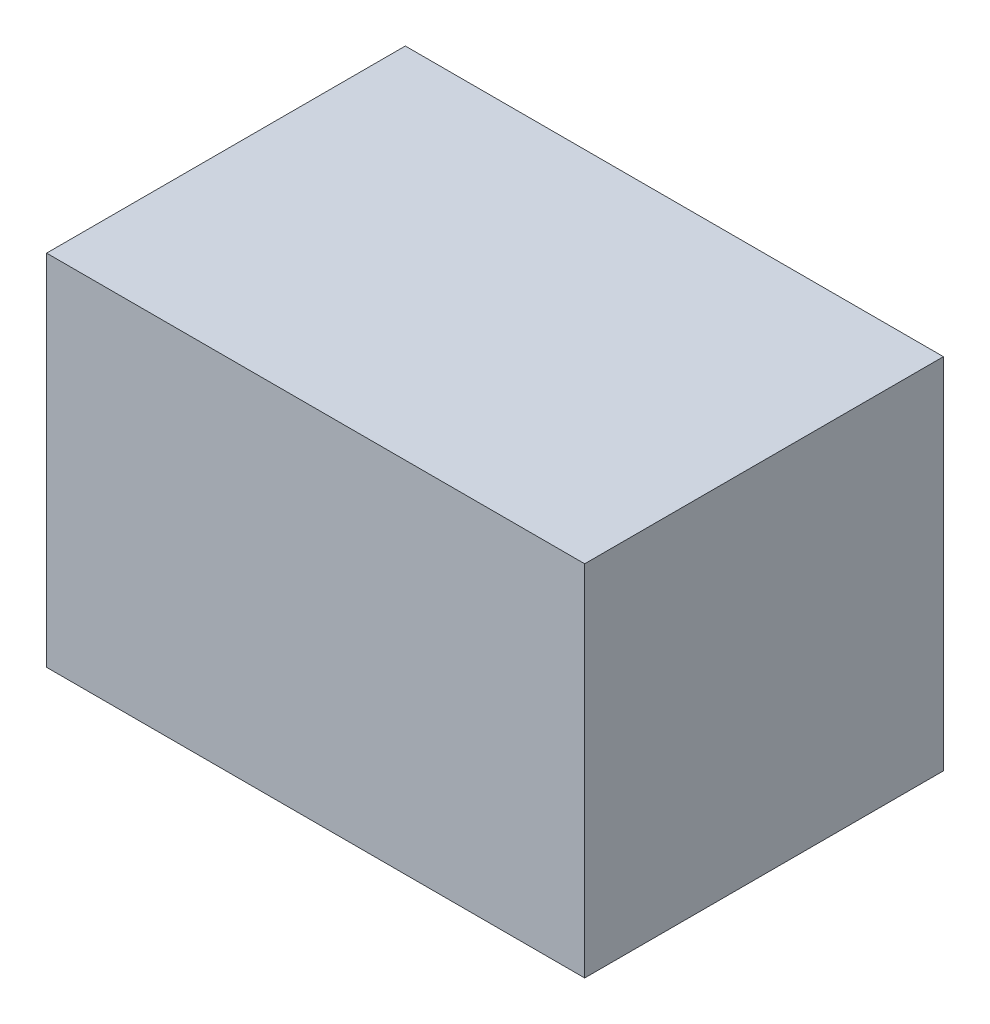
ISO-10303-21;
HEADER;
FILE_DESCRIPTION(('STEP AP214'),'2;1');
FILE_NAME('part.step','',(''),(''),'','','');
FILE_SCHEMA(('AUTOMOTIVE_DESIGN { 1 0 10303 214 1 1 1 1 }'));
ENDSEC;
DATA;
#1=APPLICATION_CONTEXT('core data for automotive mechanical design processes');
#2=APPLICATION_PROTOCOL_DEFINITION('international standard','automotive_design',2000,#1);
#3=PRODUCT_CONTEXT('',#1,'mechanical');
#4=PRODUCT('Part','Part','',(#3));
#5=PRODUCT_RELATED_PRODUCT_CATEGORY('part','',(#4));
#6=PRODUCT_DEFINITION_FORMATION('','',#4);
#7=PRODUCT_DEFINITION_CONTEXT('part definition',#1,'design');
#8=PRODUCT_DEFINITION('design','',#6,#7);
#9=PRODUCT_DEFINITION_SHAPE('','',#8);
#10=(LENGTH_UNIT() NAMED_UNIT(*) SI_UNIT(.MILLI.,.METRE.));
#11=(NAMED_UNIT(*) PLANE_ANGLE_UNIT() SI_UNIT($,.RADIAN.));
#12=(NAMED_UNIT(*) SI_UNIT($,.STERADIAN.) SOLID_ANGLE_UNIT());
#13=UNCERTAINTY_MEASURE_WITH_UNIT(LENGTH_MEASURE(1.E-05),#10,'distance_accuracy_value','');
#14=(GEOMETRIC_REPRESENTATION_CONTEXT(3) GLOBAL_UNCERTAINTY_ASSIGNED_CONTEXT((#13)) GLOBAL_UNIT_ASSIGNED_CONTEXT((#10,
#11,#12)) REPRESENTATION_CONTEXT('',''));
#15=CARTESIAN_POINT('',(0.,0.,0.));
#16=DIRECTION('',(0.,0.,1.));
#17=DIRECTION('',(1.,0.,0.));
#18=AXIS2_PLACEMENT_3D('',#15,#16,#17);
#19=CARTESIAN_POINT('',(550.,900.,-640.));
#20=DIRECTION('',(-1.,0.,0.));
#21=DIRECTION('',(0.,0.,1.));
#22=AXIS2_PLACEMENT_3D('',#19,#20,#21);
#23=PLANE('',#22);
#24=DIRECTION('',(0.,-1.,0.));
#25=VECTOR('',#24,1.);
#26=CARTESIAN_POINT('',(550.,900.,-620.));
#27=LINE('',#26,#25);
#28=CARTESIAN_POINT('',(550.,920.,-620.));
#29=VERTEX_POINT('',#28);
#30=CARTESIAN_POINT('',(550.,900.,-620.));
#31=VERTEX_POINT('',#30);
#32=EDGE_CURVE('E103',#29,#31,#27,.T.);
#33=ORIENTED_EDGE('',*,*,#32,.F.);
#34=DIRECTION('',(0.,0.,1.));
#35=VECTOR('',#34,1.);
#36=CARTESIAN_POINT('',(550.,920.,-640.));
#37=LINE('',#36,#35);
#38=CARTESIAN_POINT('',(550.,920.,-640.));
#39=VERTEX_POINT('',#38);
#40=EDGE_CURVE('E11',#39,#29,#37,.T.);
#41=ORIENTED_EDGE('',*,*,#40,.F.);
#42=DIRECTION('',(0.,-1.,0.));
#43=VECTOR('',#42,1.);
#44=CARTESIAN_POINT('',(550.,900.,-640.));
#45=LINE('',#44,#43);
#46=CARTESIAN_POINT('',(550.,900.,-640.));
#47=VERTEX_POINT('',#46);
#48=EDGE_CURVE('E97',#39,#47,#45,.T.);
#49=ORIENTED_EDGE('',*,*,#48,.T.);
#50=DIRECTION('',(0.,0.,1.));
#51=VECTOR('',#50,1.);
#52=CARTESIAN_POINT('',(550.,900.,-640.));
#53=LINE('',#52,#51);
#54=EDGE_CURVE('E42',#47,#31,#53,.T.);
#55=ORIENTED_EDGE('',*,*,#54,.T.);
#56=EDGE_LOOP('',(#33,#41,#49,#55));
#57=FACE_BOUND('',#56,.T.);
#58=ADVANCED_FACE('F39',(#57),#23,.T.);
#59=CARTESIAN_POINT('',(550.,920.,-640.));
#60=DIRECTION('',(0.,1.,0.));
#61=DIRECTION('',(0.,0.,1.));
#62=AXIS2_PLACEMENT_3D('',#59,#60,#61);
#63=PLANE('',#62);
#64=DIRECTION('',(-1.,0.,0.));
#65=VECTOR('',#64,1.);
#66=CARTESIAN_POINT('',(550.,920.,-620.));
#67=LINE('',#66,#65);
#68=CARTESIAN_POINT('',(580.,920.,-620.));
#69=VERTEX_POINT('',#68);
#70=EDGE_CURVE('E99',#69,#29,#67,.T.);
#71=ORIENTED_EDGE('',*,*,#70,.F.);
#72=DIRECTION('',(0.,0.,1.));
#73=VECTOR('',#72,1.);
#74=CARTESIAN_POINT('',(580.,920.,-640.));
#75=LINE('',#74,#73);
#76=CARTESIAN_POINT('',(580.,920.,-640.));
#77=VERTEX_POINT('',#76);
#78=EDGE_CURVE('E48',#77,#69,#75,.T.);
#79=ORIENTED_EDGE('',*,*,#78,.F.);
#80=DIRECTION('',(-1.,0.,0.));
#81=VECTOR('',#80,1.);
#82=CARTESIAN_POINT('',(550.,920.,-640.));
#83=LINE('',#82,#81);
#84=EDGE_CURVE('E94',#77,#39,#83,.T.);
#85=ORIENTED_EDGE('',*,*,#84,.T.);
#86=ORIENTED_EDGE('',*,*,#40,.T.);
#87=EDGE_LOOP('',(#71,#79,#85,#86));
#88=FACE_BOUND('',#87,.T.);
#89=ADVANCED_FACE('F113',(#88),#63,.T.);
#90=CARTESIAN_POINT('',(580.,900.,-640.));
#91=DIRECTION('',(1.,0.,0.));
#92=DIRECTION('',(0.,0.,-1.));
#93=AXIS2_PLACEMENT_3D('',#90,#91,#92);
#94=PLANE('',#93);
#95=DIRECTION('',(0.,1.,0.));
#96=VECTOR('',#95,1.);
#97=CARTESIAN_POINT('',(580.,900.,-620.));
#98=LINE('',#97,#96);
#99=CARTESIAN_POINT('',(580.,900.,-620.));
#100=VERTEX_POINT('',#99);
#101=EDGE_CURVE('E89',#100,#69,#98,.T.);
#102=ORIENTED_EDGE('',*,*,#101,.F.);
#103=DIRECTION('',(0.,0.,1.));
#104=VECTOR('',#103,1.);
#105=CARTESIAN_POINT('',(580.,900.,-640.));
#106=LINE('',#105,#104);
#107=CARTESIAN_POINT('',(580.,900.,-640.));
#108=VERTEX_POINT('',#107);
#109=EDGE_CURVE('E84',#108,#100,#106,.T.);
#110=ORIENTED_EDGE('',*,*,#109,.F.);
#111=DIRECTION('',(0.,1.,0.));
#112=VECTOR('',#111,1.);
#113=CARTESIAN_POINT('',(580.,900.,-640.));
#114=LINE('',#113,#112);
#115=EDGE_CURVE('E87',#108,#77,#114,.T.);
#116=ORIENTED_EDGE('',*,*,#115,.T.);
#117=ORIENTED_EDGE('',*,*,#78,.T.);
#118=EDGE_LOOP('',(#102,#110,#116,#117));
#119=FACE_BOUND('',#118,.T.);
#120=ADVANCED_FACE('F86',(#119),#94,.T.);
#121=CARTESIAN_POINT('',(550.,900.,-640.));
#122=DIRECTION('',(0.,-1.,0.));
#123=DIRECTION('',(0.,0.,-1.));
#124=AXIS2_PLACEMENT_3D('',#121,#122,#123);
#125=PLANE('',#124);
#126=DIRECTION('',(1.,0.,0.));
#127=VECTOR('',#126,1.);
#128=CARTESIAN_POINT('',(550.,900.,-620.));
#129=LINE('',#128,#127);
#130=EDGE_CURVE('E106',#31,#100,#129,.T.);
#131=ORIENTED_EDGE('',*,*,#130,.F.);
#132=ORIENTED_EDGE('',*,*,#54,.F.);
#133=DIRECTION('',(1.,0.,0.));
#134=VECTOR('',#133,1.);
#135=CARTESIAN_POINT('',(550.,900.,-640.));
#136=LINE('',#135,#134);
#137=EDGE_CURVE('E93',#47,#108,#136,.T.);
#138=ORIENTED_EDGE('',*,*,#137,.T.);
#139=ORIENTED_EDGE('',*,*,#109,.T.);
#140=EDGE_LOOP('',(#131,#132,#138,#139));
#141=FACE_BOUND('',#140,.T.);
#142=ADVANCED_FACE('F96',(#141),#125,.T.);
#143=CARTESIAN_POINT('',(0.,0.,-640.));
#144=DIRECTION('',(0.,0.,-1.));
#145=DIRECTION('',(-1.,0.,0.));
#146=AXIS2_PLACEMENT_3D('',#143,#144,#145);
#147=PLANE('',#146);
#148=ORIENTED_EDGE('',*,*,#48,.F.);
#149=ORIENTED_EDGE('',*,*,#84,.F.);
#150=ORIENTED_EDGE('',*,*,#115,.F.);
#151=ORIENTED_EDGE('',*,*,#137,.F.);
#152=EDGE_LOOP('',(#148,#149,#150,#151));
#153=FACE_BOUND('',#152,.T.);
#154=ADVANCED_FACE('F92',(#153),#147,.T.);
#155=CARTESIAN_POINT('',(0.,0.,-620.));
#156=DIRECTION('',(0.,0.,-1.));
#157=DIRECTION('',(-1.,0.,0.));
#158=AXIS2_PLACEMENT_3D('',#155,#156,#157);
#159=PLANE('',#158);
#160=ORIENTED_EDGE('',*,*,#32,.T.);
#161=ORIENTED_EDGE('',*,*,#130,.T.);
#162=ORIENTED_EDGE('',*,*,#101,.T.);
#163=ORIENTED_EDGE('',*,*,#70,.T.);
#164=EDGE_LOOP('',(#160,#161,#162,#163));
#165=FACE_BOUND('',#164,.T.);
#166=ADVANCED_FACE('F112',(#165),#159,.F.);
#167=CLOSED_SHELL('',(#58,#89,#120,#142,#154,#166));
#168=MANIFOLD_SOLID_BREP('B2',#167);
#169=ADVANCED_BREP_SHAPE_REPRESENTATION('',(#18,#168),#14);
#170=SHAPE_DEFINITION_REPRESENTATION(#9,#169);
ENDSEC;
END-ISO-10303-21;
